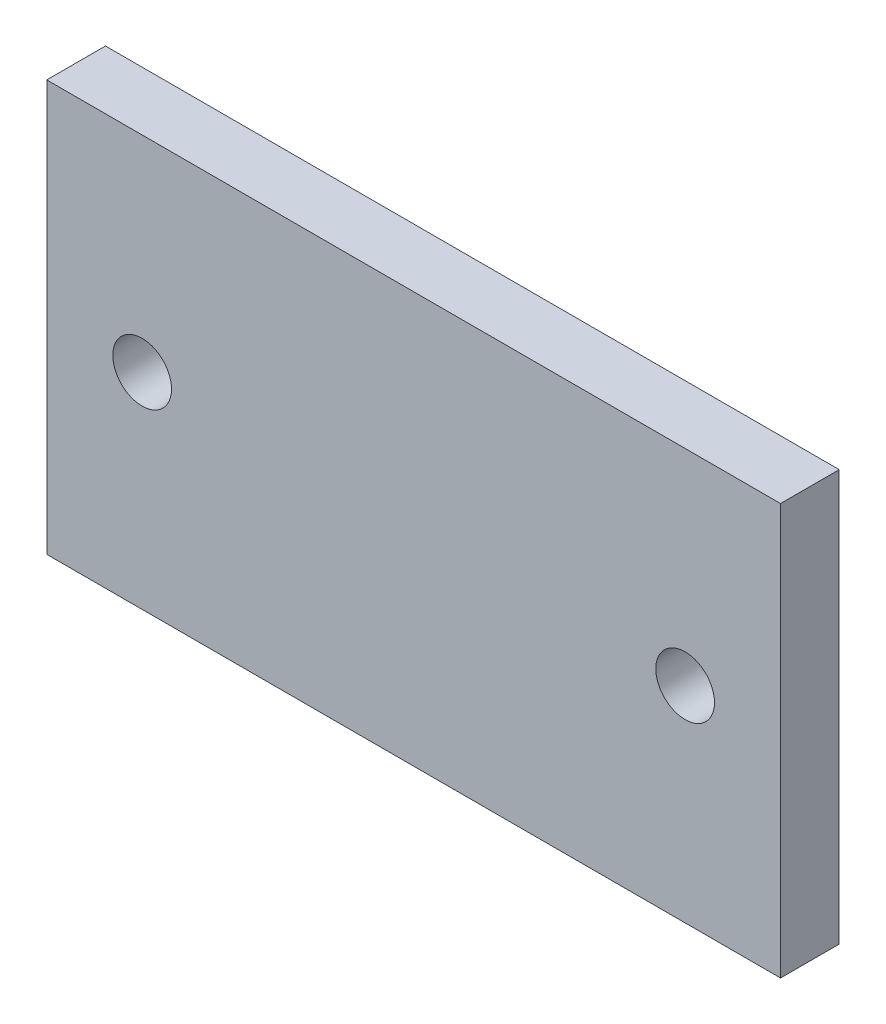
ISO-10303-21;
HEADER;
FILE_DESCRIPTION(('STEP AP214'),'2;1');
FILE_NAME('part.step','',(''),(''),'','','');
FILE_SCHEMA(('AUTOMOTIVE_DESIGN { 1 0 10303 214 1 1 1 1 }'));
ENDSEC;
DATA;
#1=APPLICATION_CONTEXT('core data for automotive mechanical design processes');
#2=APPLICATION_PROTOCOL_DEFINITION('international standard','automotive_design',2000,#1);
#3=PRODUCT_CONTEXT('',#1,'mechanical');
#4=PRODUCT('Part','Part','',(#3));
#5=PRODUCT_RELATED_PRODUCT_CATEGORY('part','',(#4));
#6=PRODUCT_DEFINITION_FORMATION('','',#4);
#7=PRODUCT_DEFINITION_CONTEXT('part definition',#1,'design');
#8=PRODUCT_DEFINITION('design','',#6,#7);
#9=PRODUCT_DEFINITION_SHAPE('','',#8);
#10=(LENGTH_UNIT() NAMED_UNIT(*) SI_UNIT(.MILLI.,.METRE.));
#11=(NAMED_UNIT(*) PLANE_ANGLE_UNIT() SI_UNIT($,.RADIAN.));
#12=(NAMED_UNIT(*) SI_UNIT($,.STERADIAN.) SOLID_ANGLE_UNIT());
#13=UNCERTAINTY_MEASURE_WITH_UNIT(LENGTH_MEASURE(1.E-05),#10,'distance_accuracy_value','');
#14=(GEOMETRIC_REPRESENTATION_CONTEXT(3) GLOBAL_UNCERTAINTY_ASSIGNED_CONTEXT((#13)) GLOBAL_UNIT_ASSIGNED_CONTEXT((#10,
#11,#12)) REPRESENTATION_CONTEXT('',''));
#15=CARTESIAN_POINT('',(0.,0.,0.));
#16=DIRECTION('',(0.,0.,1.));
#17=DIRECTION('',(1.,0.,0.));
#18=AXIS2_PLACEMENT_3D('',#15,#16,#17);
#19=CARTESIAN_POINT('',(0.,0.,19.9999999999994));
#20=DIRECTION('',(0.,0.,-1.));
#21=DIRECTION('',(-1.,0.,0.));
#22=AXIS2_PLACEMENT_3D('',#19,#20,#21);
#23=PLANE('',#22);
#24=DIRECTION('',(0.,1.,0.));
#25=VECTOR('',#24,1.);
#26=CARTESIAN_POINT('',(107.466996699669,43.9356435643565,20.0000000000031));
#27=LINE('',#26,#25);
#28=CARTESIAN_POINT('',(107.46699669967,-96.064356435642,20.0000000000031));
#29=VERTEX_POINT('',#28);
#30=CARTESIAN_POINT('',(107.466996699669,43.9356435643565,20.0000000000031));
#31=VERTEX_POINT('',#30);
#32=EDGE_CURVE('E84',#29,#31,#27,.T.);
#33=ORIENTED_EDGE('',*,*,#32,.T.);
#34=DIRECTION('',(-1.,0.,0.));
#35=VECTOR('',#34,1.);
#36=CARTESIAN_POINT('',(107.466996699669,43.9356435643565,20.0000000000031));
#37=LINE('',#36,#35);
#38=CARTESIAN_POINT('',(-142.533003300331,43.9356435643572,20.0000000000031));
#39=VERTEX_POINT('',#38);
#40=EDGE_CURVE('E79',#31,#39,#37,.T.);
#41=ORIENTED_EDGE('',*,*,#40,.T.);
#42=DIRECTION('',(0.,-1.,0.));
#43=VECTOR('',#42,1.);
#44=CARTESIAN_POINT('',(-142.533003300331,43.9356435643572,20.0000000000031));
#45=LINE('',#44,#43);
#46=CARTESIAN_POINT('',(-142.53300330033,-96.0643564356436,20.0000000000031));
#47=VERTEX_POINT('',#46);
#48=EDGE_CURVE('E82',#39,#47,#45,.T.);
#49=ORIENTED_EDGE('',*,*,#48,.T.);
#50=DIRECTION('',(1.,0.,0.));
#51=VECTOR('',#50,1.);
#52=CARTESIAN_POINT('',(107.46699669967,-96.064356435642,20.0000000000031));
#53=LINE('',#52,#51);
#54=EDGE_CURVE('E49',#47,#29,#53,.T.);
#55=ORIENTED_EDGE('',*,*,#54,.T.);
#56=EDGE_LOOP('',(#33,#41,#49,#55));
#57=FACE_BOUND('',#56,.T.);
#58=CARTESIAN_POINT('',(74.9669966996691,-26.0643564356436,20.0000000000031));
#59=DIRECTION('',(0.,0.,1.));
#60=DIRECTION('',(1.,0.,0.));
#61=AXIS2_PLACEMENT_3D('',#58,#59,#60);
#62=CIRCLE('',#61,9.99999999999999);
#63=CARTESIAN_POINT('',(84.9669966996691,-26.0643564356436,20.0000000000031));
#64=VERTEX_POINT('',#63);
#65=EDGE_CURVE('E99',#64,#64,#62,.T.);
#66=ORIENTED_EDGE('',*,*,#65,.F.);
#67=EDGE_LOOP('',(#66));
#68=FACE_BOUND('',#67,.T.);
#69=CARTESIAN_POINT('',(-110.03300330033,-26.0643564356435,20.0000000000031));
#70=DIRECTION('',(0.,0.,1.));
#71=DIRECTION('',(1.,0.,0.));
#72=AXIS2_PLACEMENT_3D('',#69,#70,#71);
#73=CIRCLE('',#72,9.99999999999999);
#74=CARTESIAN_POINT('',(-100.03300330033,-26.0643564356435,20.0000000000031));
#75=VERTEX_POINT('',#74);
#76=EDGE_CURVE('E114',#75,#75,#73,.T.);
#77=ORIENTED_EDGE('',*,*,#76,.F.);
#78=EDGE_LOOP('',(#77));
#79=FACE_BOUND('',#78,.T.);
#80=ADVANCED_FACE('F32',(#57,#68,#79),#23,.F.);
#81=CARTESIAN_POINT('',(0.,0.,0.));
#82=DIRECTION('',(0.,0.,-1.));
#83=DIRECTION('',(-1.,0.,0.));
#84=AXIS2_PLACEMENT_3D('',#81,#82,#83);
#85=PLANE('',#84);
#86=CARTESIAN_POINT('',(74.9669966996699,-26.0643564356435,3.10862446895044E-12));
#87=DIRECTION('',(0.,0.,1.));
#88=DIRECTION('',(1.,0.,0.));
#89=AXIS2_PLACEMENT_3D('',#86,#87,#88);
#90=CIRCLE('',#89,9.99999999999999);
#91=CARTESIAN_POINT('',(84.9669966996699,-26.0643564356435,3.10862446895044E-12));
#92=VERTEX_POINT('',#91);
#93=EDGE_CURVE('E111',#92,#92,#90,.T.);
#94=ORIENTED_EDGE('',*,*,#93,.T.);
#95=EDGE_LOOP('',(#94));
#96=FACE_BOUND('',#95,.T.);
#97=DIRECTION('',(0.,1.,0.));
#98=VECTOR('',#97,1.);
#99=CARTESIAN_POINT('',(107.46699669967,43.9356435643565,3.10862446895044E-12));
#100=LINE('',#99,#98);
#101=CARTESIAN_POINT('',(107.46699669967,-96.0643564356436,3.10862446895044E-12));
#102=VERTEX_POINT('',#101);
#103=CARTESIAN_POINT('',(107.46699669967,43.9356435643565,3.10862446895044E-12));
#104=VERTEX_POINT('',#103);
#105=EDGE_CURVE('E96',#102,#104,#100,.T.);
#106=ORIENTED_EDGE('',*,*,#105,.F.);
#107=DIRECTION('',(1.,0.,0.));
#108=VECTOR('',#107,1.);
#109=CARTESIAN_POINT('',(107.46699669967,-96.0643564356436,3.10862446895044E-12));
#110=LINE('',#109,#108);
#111=CARTESIAN_POINT('',(-142.53300330033,-96.0643564356436,3.10862446895044E-12));
#112=VERTEX_POINT('',#111);
#113=EDGE_CURVE('E72',#112,#102,#110,.T.);
#114=ORIENTED_EDGE('',*,*,#113,.F.);
#115=DIRECTION('',(0.,-1.,0.));
#116=VECTOR('',#115,1.);
#117=CARTESIAN_POINT('',(-142.533003300331,43.9356435643564,2.77555756156289E-12));
#118=LINE('',#117,#116);
#119=CARTESIAN_POINT('',(-142.533003300331,43.9356435643564,2.77555756156289E-12));
#120=VERTEX_POINT('',#119);
#121=EDGE_CURVE('E66',#120,#112,#118,.T.);
#122=ORIENTED_EDGE('',*,*,#121,.F.);
#123=DIRECTION('',(-1.,0.,0.));
#124=VECTOR('',#123,1.);
#125=CARTESIAN_POINT('',(107.46699669967,43.9356435643565,3.10862446895044E-12));
#126=LINE('',#125,#124);
#127=EDGE_CURVE('E88',#104,#120,#126,.T.);
#128=ORIENTED_EDGE('',*,*,#127,.F.);
#129=EDGE_LOOP('',(#106,#114,#122,#128));
#130=FACE_BOUND('',#129,.T.);
#131=CARTESIAN_POINT('',(-110.03300330033,-26.0643564356435,3.10862446895044E-12));
#132=DIRECTION('',(0.,0.,1.));
#133=DIRECTION('',(1.,0.,0.));
#134=AXIS2_PLACEMENT_3D('',#131,#132,#133);
#135=CIRCLE('',#134,9.99999999999999);
#136=CARTESIAN_POINT('',(-100.03300330033,-26.0643564356435,3.10862446895044E-12));
#137=VERTEX_POINT('',#136);
#138=EDGE_CURVE('E117',#137,#137,#135,.T.);
#139=ORIENTED_EDGE('',*,*,#138,.T.);
#140=EDGE_LOOP('',(#139));
#141=FACE_BOUND('',#140,.T.);
#142=ADVANCED_FACE('F107',(#96,#130,#141),#85,.T.);
#143=CARTESIAN_POINT('',(107.466996699669,43.9356435643565,20.0000000000031));
#144=DIRECTION('',(-1.,0.,0.));
#145=DIRECTION('',(0.,-1.,0.));
#146=AXIS2_PLACEMENT_3D('',#143,#144,#145);
#147=PLANE('',#146);
#148=ORIENTED_EDGE('',*,*,#105,.T.);
#149=DIRECTION('',(0.,0.,-1.));
#150=VECTOR('',#149,1.);
#151=CARTESIAN_POINT('',(107.466996699669,43.9356435643565,20.0000000000031));
#152=LINE('',#151,#150);
#153=EDGE_CURVE('E11',#31,#104,#152,.T.);
#154=ORIENTED_EDGE('',*,*,#153,.F.);
#155=ORIENTED_EDGE('',*,*,#32,.F.);
#156=DIRECTION('',(0.,0.,-1.));
#157=VECTOR('',#156,1.);
#158=CARTESIAN_POINT('',(107.46699669967,-96.064356435642,20.0000000000031));
#159=LINE('',#158,#157);
#160=EDGE_CURVE('E92',#29,#102,#159,.T.);
#161=ORIENTED_EDGE('',*,*,#160,.T.);
#162=EDGE_LOOP('',(#148,#154,#155,#161));
#163=FACE_BOUND('',#162,.T.);
#164=ADVANCED_FACE('F34',(#163),#147,.F.);
#165=CARTESIAN_POINT('',(107.466996699669,43.9356435643565,20.0000000000031));
#166=DIRECTION('',(0.,-1.,0.));
#167=DIRECTION('',(0.,0.,-1.));
#168=AXIS2_PLACEMENT_3D('',#165,#166,#167);
#169=PLANE('',#168);
#170=ORIENTED_EDGE('',*,*,#127,.T.);
#171=DIRECTION('',(0.,0.,-1.));
#172=VECTOR('',#171,1.);
#173=CARTESIAN_POINT('',(-142.533003300331,43.9356435643572,20.0000000000031));
#174=LINE('',#173,#172);
#175=EDGE_CURVE('E41',#39,#120,#174,.T.);
#176=ORIENTED_EDGE('',*,*,#175,.F.);
#177=ORIENTED_EDGE('',*,*,#40,.F.);
#178=ORIENTED_EDGE('',*,*,#153,.T.);
#179=EDGE_LOOP('',(#170,#176,#177,#178));
#180=FACE_BOUND('',#179,.T.);
#181=ADVANCED_FACE('F87',(#180),#169,.F.);
#182=CARTESIAN_POINT('',(-142.533003300331,43.9356435643572,20.0000000000031));
#183=DIRECTION('',(1.,0.,0.));
#184=DIRECTION('',(0.,0.,-1.));
#185=AXIS2_PLACEMENT_3D('',#182,#183,#184);
#186=PLANE('',#185);
#187=ORIENTED_EDGE('',*,*,#121,.T.);
#188=DIRECTION('',(0.,0.,-1.));
#189=VECTOR('',#188,1.);
#190=CARTESIAN_POINT('',(-142.53300330033,-96.0643564356436,20.0000000000031));
#191=LINE('',#190,#189);
#192=EDGE_CURVE('E89',#47,#112,#191,.T.);
#193=ORIENTED_EDGE('',*,*,#192,.F.);
#194=ORIENTED_EDGE('',*,*,#48,.F.);
#195=ORIENTED_EDGE('',*,*,#175,.T.);
#196=EDGE_LOOP('',(#187,#193,#194,#195));
#197=FACE_BOUND('',#196,.T.);
#198=ADVANCED_FACE('F90',(#197),#186,.F.);
#199=CARTESIAN_POINT('',(107.46699669967,-96.064356435642,20.0000000000031));
#200=DIRECTION('',(0.,1.,0.));
#201=DIRECTION('',(-1.,0.,0.));
#202=AXIS2_PLACEMENT_3D('',#199,#200,#201);
#203=PLANE('',#202);
#204=ORIENTED_EDGE('',*,*,#113,.T.);
#205=ORIENTED_EDGE('',*,*,#160,.F.);
#206=ORIENTED_EDGE('',*,*,#54,.F.);
#207=ORIENTED_EDGE('',*,*,#192,.T.);
#208=EDGE_LOOP('',(#204,#205,#206,#207));
#209=FACE_BOUND('',#208,.T.);
#210=ADVANCED_FACE('F104',(#209),#203,.F.);
#211=CARTESIAN_POINT('',(74.9669966996691,-26.0643564356436,20.0000000000031));
#212=DIRECTION('',(0.,0.,-1.));
#213=DIRECTION('',(-1.,0.,0.));
#214=AXIS2_PLACEMENT_3D('',#211,#212,#213);
#215=CYLINDRICAL_SURFACE('',#214,9.99999999999999);
#216=ORIENTED_EDGE('',*,*,#65,.T.);
#217=EDGE_LOOP('',(#216));
#218=FACE_BOUND('',#217,.T.);
#219=ORIENTED_EDGE('',*,*,#93,.F.);
#220=EDGE_LOOP('',(#219));
#221=FACE_BOUND('',#220,.T.);
#222=ADVANCED_FACE('F134',(#218,#221),#215,.F.);
#223=CARTESIAN_POINT('',(-110.03300330033,-26.0643564356435,20.0000000000031));
#224=DIRECTION('',(0.,0.,-1.));
#225=DIRECTION('',(-1.,0.,0.));
#226=AXIS2_PLACEMENT_3D('',#223,#224,#225);
#227=CYLINDRICAL_SURFACE('',#226,9.99999999999999);
#228=ORIENTED_EDGE('',*,*,#76,.T.);
#229=EDGE_LOOP('',(#228));
#230=FACE_BOUND('',#229,.T.);
#231=ORIENTED_EDGE('',*,*,#138,.F.);
#232=EDGE_LOOP('',(#231));
#233=FACE_BOUND('',#232,.T.);
#234=ADVANCED_FACE('F123',(#230,#233),#227,.F.);
#235=CLOSED_SHELL('',(#80,#142,#164,#181,#198,#210,#222,#234));
#236=MANIFOLD_SOLID_BREP('B2',#235);
#237=ADVANCED_BREP_SHAPE_REPRESENTATION('',(#18,#236),#14);
#238=SHAPE_DEFINITION_REPRESENTATION(#9,#237);
ENDSEC;
END-ISO-10303-21;
